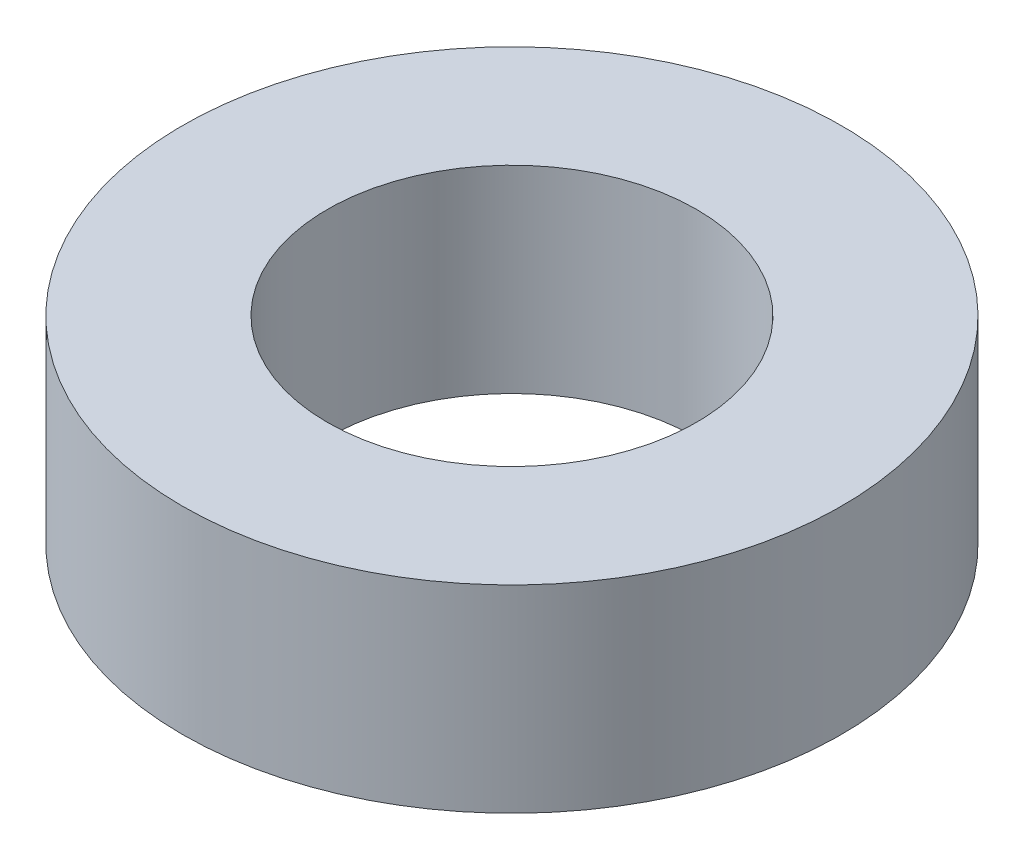
ISO-10303-21;
HEADER;
FILE_DESCRIPTION(('STEP AP214'),'2;1');
FILE_NAME('part.step','',(''),(''),'','','');
FILE_SCHEMA(('AUTOMOTIVE_DESIGN { 1 0 10303 214 1 1 1 1 }'));
ENDSEC;
DATA;
#1=APPLICATION_CONTEXT('core data for automotive mechanical design processes');
#2=APPLICATION_PROTOCOL_DEFINITION('international standard','automotive_design',2000,#1);
#3=PRODUCT_CONTEXT('',#1,'mechanical');
#4=PRODUCT('Part','Part','',(#3));
#5=PRODUCT_RELATED_PRODUCT_CATEGORY('part','',(#4));
#6=PRODUCT_DEFINITION_FORMATION('','',#4);
#7=PRODUCT_DEFINITION_CONTEXT('part definition',#1,'design');
#8=PRODUCT_DEFINITION('design','',#6,#7);
#9=PRODUCT_DEFINITION_SHAPE('','',#8);
#10=(LENGTH_UNIT() NAMED_UNIT(*) SI_UNIT(.MILLI.,.METRE.));
#11=(NAMED_UNIT(*) PLANE_ANGLE_UNIT() SI_UNIT($,.RADIAN.));
#12=(NAMED_UNIT(*) SI_UNIT($,.STERADIAN.) SOLID_ANGLE_UNIT());
#13=UNCERTAINTY_MEASURE_WITH_UNIT(LENGTH_MEASURE(1.E-05),#10,'distance_accuracy_value','');
#14=(GEOMETRIC_REPRESENTATION_CONTEXT(3) GLOBAL_UNCERTAINTY_ASSIGNED_CONTEXT((#13)) GLOBAL_UNIT_ASSIGNED_CONTEXT((#10,
#11,#12)) REPRESENTATION_CONTEXT('',''));
#15=CARTESIAN_POINT('',(0.,0.,0.));
#16=DIRECTION('',(0.,0.,1.));
#17=DIRECTION('',(1.,0.,0.));
#18=AXIS2_PLACEMENT_3D('',#15,#16,#17);
#19=CARTESIAN_POINT('',(0.,7.5,0.));
#20=DIRECTION('',(0.,1.,0.));
#21=DIRECTION('',(0.,0.,1.));
#22=AXIS2_PLACEMENT_3D('',#19,#20,#21);
#23=PLANE('',#22);
#24=CARTESIAN_POINT('',(0.,7.5,0.));
#25=DIRECTION('',(0.,1.,0.));
#26=DIRECTION('',(0.,0.,1.));
#27=AXIS2_PLACEMENT_3D('',#24,#25,#26);
#28=CIRCLE('',#27,12.5);
#29=CARTESIAN_POINT('',(0.,7.5,12.5));
#30=VERTEX_POINT('',#29);
#31=EDGE_CURVE('E10',#30,#30,#28,.T.);
#32=ORIENTED_EDGE('',*,*,#31,.T.);
#33=EDGE_LOOP('',(#32));
#34=FACE_BOUND('',#33,.T.);
#35=CARTESIAN_POINT('',(0.,7.5,0.));
#36=DIRECTION('',(0.,1.,0.));
#37=DIRECTION('',(0.,0.,1.));
#38=AXIS2_PLACEMENT_3D('',#35,#36,#37);
#39=CIRCLE('',#38,7.);
#40=CARTESIAN_POINT('',(0.,7.5,7.));
#41=VERTEX_POINT('',#40);
#42=EDGE_CURVE('E50',#41,#41,#39,.T.);
#43=ORIENTED_EDGE('',*,*,#42,.F.);
#44=EDGE_LOOP('',(#43));
#45=FACE_BOUND('',#44,.T.);
#46=ADVANCED_FACE('F37',(#34,#45),#23,.T.);
#47=CARTESIAN_POINT('',(0.,0.,0.));
#48=DIRECTION('',(0.,1.,0.));
#49=DIRECTION('',(0.,0.,1.));
#50=AXIS2_PLACEMENT_3D('',#47,#48,#49);
#51=PLANE('',#50);
#52=CARTESIAN_POINT('',(0.,0.,0.));
#53=DIRECTION('',(0.,1.,0.));
#54=DIRECTION('',(0.,0.,1.));
#55=AXIS2_PLACEMENT_3D('',#52,#53,#54);
#56=CIRCLE('',#55,12.5);
#57=CARTESIAN_POINT('',(0.,0.,12.5));
#58=VERTEX_POINT('',#57);
#59=EDGE_CURVE('E41',#58,#58,#56,.T.);
#60=ORIENTED_EDGE('',*,*,#59,.F.);
#61=EDGE_LOOP('',(#60));
#62=FACE_BOUND('',#61,.T.);
#63=CARTESIAN_POINT('',(0.,0.,0.));
#64=DIRECTION('',(0.,1.,0.));
#65=DIRECTION('',(0.,0.,1.));
#66=AXIS2_PLACEMENT_3D('',#63,#64,#65);
#67=CIRCLE('',#66,7.);
#68=CARTESIAN_POINT('',(0.,0.,7.));
#69=VERTEX_POINT('',#68);
#70=EDGE_CURVE('E52',#69,#69,#67,.T.);
#71=ORIENTED_EDGE('',*,*,#70,.T.);
#72=EDGE_LOOP('',(#71));
#73=FACE_BOUND('',#72,.T.);
#74=ADVANCED_FACE('F64',(#62,#73),#51,.F.);
#75=CARTESIAN_POINT('',(0.,7.5,0.));
#76=DIRECTION('',(0.,-1.,0.));
#77=DIRECTION('',(0.,0.,-1.));
#78=AXIS2_PLACEMENT_3D('',#75,#76,#77);
#79=CYLINDRICAL_SURFACE('',#78,12.5);
#80=ORIENTED_EDGE('',*,*,#31,.F.);
#81=EDGE_LOOP('',(#80));
#82=FACE_BOUND('',#81,.T.);
#83=ORIENTED_EDGE('',*,*,#59,.T.);
#84=EDGE_LOOP('',(#83));
#85=FACE_BOUND('',#84,.T.);
#86=ADVANCED_FACE('F39',(#82,#85),#79,.T.);
#87=CARTESIAN_POINT('',(0.,7.5,0.));
#88=DIRECTION('',(0.,-1.,0.));
#89=DIRECTION('',(0.,0.,-1.));
#90=AXIS2_PLACEMENT_3D('',#87,#88,#89);
#91=CYLINDRICAL_SURFACE('',#90,7.);
#92=ORIENTED_EDGE('',*,*,#42,.T.);
#93=EDGE_LOOP('',(#92));
#94=FACE_BOUND('',#93,.T.);
#95=ORIENTED_EDGE('',*,*,#70,.F.);
#96=EDGE_LOOP('',(#95));
#97=FACE_BOUND('',#96,.T.);
#98=ADVANCED_FACE('F60',(#94,#97),#91,.F.);
#99=CLOSED_SHELL('',(#46,#74,#86,#98));
#100=MANIFOLD_SOLID_BREP('B2',#99);
#101=ADVANCED_BREP_SHAPE_REPRESENTATION('',(#18,#100),#14);
#102=SHAPE_DEFINITION_REPRESENTATION(#9,#101);
ENDSEC;
END-ISO-10303-21;
